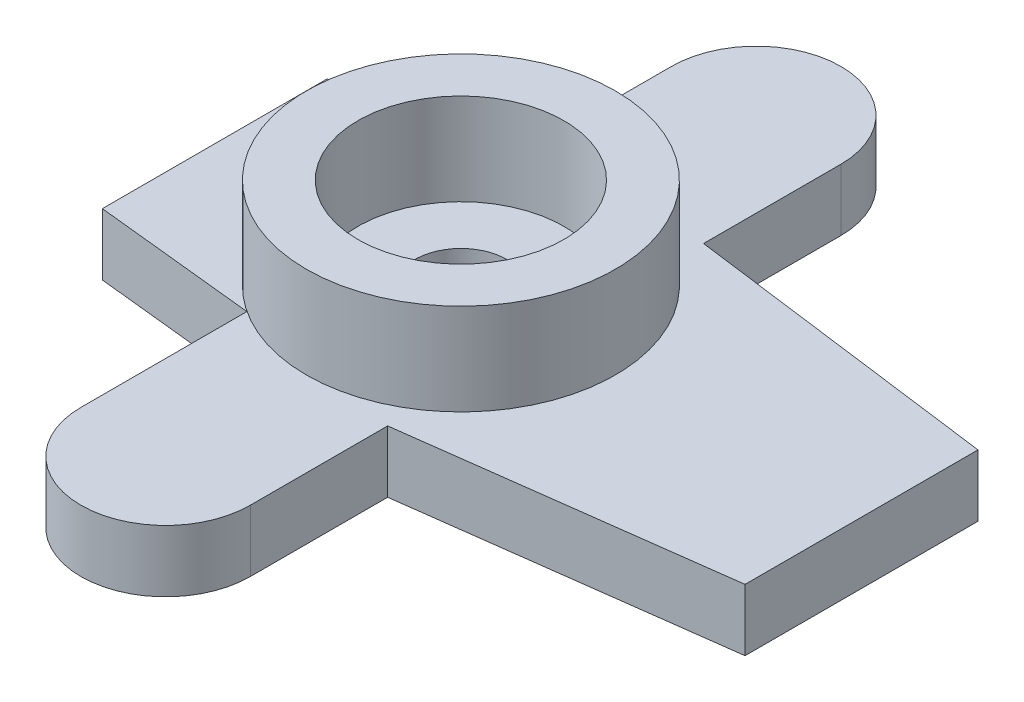
ISO-10303-21;
HEADER;
FILE_DESCRIPTION(('STEP AP214'),'2;1');
FILE_NAME('part.step','',(''),(''),'','','');
FILE_SCHEMA(('AUTOMOTIVE_DESIGN { 1 0 10303 214 1 1 1 1 }'));
ENDSEC;
DATA;
#1=APPLICATION_CONTEXT('core data for automotive mechanical design processes');
#2=APPLICATION_PROTOCOL_DEFINITION('international standard','automotive_design',2000,#1);
#3=PRODUCT_CONTEXT('',#1,'mechanical');
#4=PRODUCT('Part','Part','',(#3));
#5=PRODUCT_RELATED_PRODUCT_CATEGORY('part','',(#4));
#6=PRODUCT_DEFINITION_FORMATION('','',#4);
#7=PRODUCT_DEFINITION_CONTEXT('part definition',#1,'design');
#8=PRODUCT_DEFINITION('design','',#6,#7);
#9=PRODUCT_DEFINITION_SHAPE('','',#8);
#10=(LENGTH_UNIT() NAMED_UNIT(*) SI_UNIT(.MILLI.,.METRE.));
#11=(NAMED_UNIT(*) PLANE_ANGLE_UNIT() SI_UNIT($,.RADIAN.));
#12=(NAMED_UNIT(*) SI_UNIT($,.STERADIAN.) SOLID_ANGLE_UNIT());
#13=UNCERTAINTY_MEASURE_WITH_UNIT(LENGTH_MEASURE(1.E-05),#10,'distance_accuracy_value','');
#14=(GEOMETRIC_REPRESENTATION_CONTEXT(3) GLOBAL_UNCERTAINTY_ASSIGNED_CONTEXT((#13)) GLOBAL_UNIT_ASSIGNED_CONTEXT((#10,
#11,#12)) REPRESENTATION_CONTEXT('',''));
#15=CARTESIAN_POINT('',(0.,0.,0.));
#16=DIRECTION('',(0.,0.,1.));
#17=DIRECTION('',(1.,0.,0.));
#18=AXIS2_PLACEMENT_3D('',#15,#16,#17);
#19=CARTESIAN_POINT('',(-0.312640586171714,1.35,2.98563064108722));
#20=DIRECTION('',(-0.10414565677559,0.,0.994562055467018));
#21=DIRECTION('',(0.994562055467019,0.,0.10414565677559));
#22=AXIS2_PLACEMENT_3D('',#19,#20,#21);
#23=PLANE('',#22);
#24=DIRECTION('',(-0.994562055467019,0.,-0.10414565677559));
#25=VECTOR('',#24,1.);
#26=CARTESIAN_POINT('',(-0.312640586171714,0.,2.98563064108722));
#27=LINE('',#26,#25);
#28=CARTESIAN_POINT('',(-1.85,0.,2.82464590919123));
#29=VERTEX_POINT('',#28);
#30=CARTESIAN_POINT('',(-5.375,0.,2.45552521117549));
#31=VERTEX_POINT('',#30);
#32=EDGE_CURVE('E321',#29,#31,#27,.T.);
#33=ORIENTED_EDGE('',*,*,#32,.F.);
#34=DIRECTION('',(0.,-1.,0.));
#35=VECTOR('',#34,1.);
#36=CARTESIAN_POINT('',(-1.85,1.35,2.82464590919123));
#37=LINE('',#36,#35);
#38=CARTESIAN_POINT('',(-1.85,1.35,2.82464590919123));
#39=VERTEX_POINT('',#38);
#40=EDGE_CURVE('E12',#39,#29,#37,.T.);
#41=ORIENTED_EDGE('',*,*,#40,.F.);
#42=DIRECTION('',(-0.994562055467019,0.,-0.10414565677559));
#43=VECTOR('',#42,1.);
#44=CARTESIAN_POINT('',(-0.312640586171714,1.35,2.98563064108722));
#45=LINE('',#44,#43);
#46=CARTESIAN_POINT('',(-5.375,1.35,2.45552521117549));
#47=VERTEX_POINT('',#46);
#48=EDGE_CURVE('E340',#39,#47,#45,.T.);
#49=ORIENTED_EDGE('',*,*,#48,.T.);
#50=DIRECTION('',(0.,-1.,0.));
#51=VECTOR('',#50,1.);
#52=CARTESIAN_POINT('',(-5.375,1.35,2.45552521117549));
#53=LINE('',#52,#51);
#54=EDGE_CURVE('E193',#47,#31,#53,.T.);
#55=ORIENTED_EDGE('',*,*,#54,.T.);
#56=EDGE_LOOP('',(#33,#41,#49,#55));
#57=FACE_BOUND('',#56,.T.);
#58=ADVANCED_FACE('F173',(#57),#23,.T.);
#59=CARTESIAN_POINT('',(-0.312640586171714,1.35,-2.98563064108722));
#60=DIRECTION('',(0.10414565677559,0.,0.994562055467018));
#61=DIRECTION('',(0.994562055467019,0.,-0.10414565677559));
#62=AXIS2_PLACEMENT_3D('',#59,#60,#61);
#63=PLANE('',#62);
#64=DIRECTION('',(-0.994562055467019,0.,0.10414565677559));
#65=VECTOR('',#64,1.);
#66=CARTESIAN_POINT('',(-0.312640586171714,0.,-2.98563064108722));
#67=LINE('',#66,#65);
#68=CARTESIAN_POINT('',(-1.85,0.,-2.82464590919123));
#69=VERTEX_POINT('',#68);
#70=CARTESIAN_POINT('',(-5.375,0.,-2.45552521117549));
#71=VERTEX_POINT('',#70);
#72=EDGE_CURVE('E325',#69,#71,#67,.T.);
#73=ORIENTED_EDGE('',*,*,#72,.T.);
#74=DIRECTION('',(0.,-1.,0.));
#75=VECTOR('',#74,1.);
#76=CARTESIAN_POINT('',(-5.375,1.35,-2.45552521117549));
#77=LINE('',#76,#75);
#78=CARTESIAN_POINT('',(-5.375,1.35,-2.45552521117549));
#79=VERTEX_POINT('',#78);
#80=EDGE_CURVE('E343',#79,#71,#77,.T.);
#81=ORIENTED_EDGE('',*,*,#80,.F.);
#82=DIRECTION('',(-0.994562055467019,0.,0.10414565677559));
#83=VECTOR('',#82,1.);
#84=CARTESIAN_POINT('',(-0.312640586171714,1.35,-2.98563064108722));
#85=LINE('',#84,#83);
#86=CARTESIAN_POINT('',(-1.85,1.35,-2.82464590919123));
#87=VERTEX_POINT('',#86);
#88=EDGE_CURVE('E419',#87,#79,#85,.T.);
#89=ORIENTED_EDGE('',*,*,#88,.F.);
#90=DIRECTION('',(0.,-1.,0.));
#91=VECTOR('',#90,1.);
#92=CARTESIAN_POINT('',(-1.85,1.35,-2.82464590919123));
#93=LINE('',#92,#91);
#94=EDGE_CURVE('E184',#87,#69,#93,.T.);
#95=ORIENTED_EDGE('',*,*,#94,.T.);
#96=EDGE_LOOP('',(#73,#81,#89,#95));
#97=FACE_BOUND('',#96,.T.);
#98=ADVANCED_FACE('F421',(#97),#63,.F.);
#99=CARTESIAN_POINT('',(-5.375,1.35,0.));
#100=DIRECTION('',(-1.,0.,0.));
#101=DIRECTION('',(0.,0.,1.));
#102=AXIS2_PLACEMENT_3D('',#99,#100,#101);
#103=PLANE('',#102);
#104=DIRECTION('',(0.,0.,-1.));
#105=VECTOR('',#104,1.);
#106=CARTESIAN_POINT('',(-5.375,0.,0.));
#107=LINE('',#106,#105);
#108=EDGE_CURVE('E332',#31,#71,#107,.T.);
#109=ORIENTED_EDGE('',*,*,#108,.F.);
#110=ORIENTED_EDGE('',*,*,#54,.F.);
#111=DIRECTION('',(0.,0.,-1.));
#112=VECTOR('',#111,1.);
#113=CARTESIAN_POINT('',(-5.375,1.35,0.));
#114=LINE('',#113,#112);
#115=EDGE_CURVE('E335',#47,#79,#114,.T.);
#116=ORIENTED_EDGE('',*,*,#115,.T.);
#117=ORIENTED_EDGE('',*,*,#80,.T.);
#118=EDGE_LOOP('',(#109,#110,#116,#117));
#119=FACE_BOUND('',#118,.T.);
#120=ADVANCED_FACE('F483',(#119),#103,.T.);
#121=CARTESIAN_POINT('',(0.,1.35,0.));
#122=DIRECTION('',(0.,1.,0.));
#123=DIRECTION('',(0.,0.,1.));
#124=AXIS2_PLACEMENT_3D('',#121,#122,#123);
#125=PLANE('',#124);
#126=CARTESIAN_POINT('',(0.,1.35,0.));
#127=DIRECTION('',(0.,1.,0.));
#128=DIRECTION('',(0.,0.,1.));
#129=AXIS2_PLACEMENT_3D('',#126,#127,#128);
#130=CIRCLE('',#129,3.375);
#131=CARTESIAN_POINT('',(0.,1.35,3.375));
#132=VERTEX_POINT('',#131);
#133=EDGE_CURVE('E427',#132,#132,#130,.T.);
#134=ORIENTED_EDGE('',*,*,#133,.F.);
#135=EDGE_LOOP('',(#134));
#136=FACE_BOUND('',#135,.T.);
#137=DIRECTION('',(0.,0.,-1.));
#138=VECTOR('',#137,1.);
#139=CARTESIAN_POINT('',(-1.85,1.35,0.));
#140=LINE('',#139,#138);
#141=CARTESIAN_POINT('',(-1.85,1.35,-6.45));
#142=VERTEX_POINT('',#141);
#143=EDGE_CURVE('E350',#87,#142,#140,.T.);
#144=ORIENTED_EDGE('',*,*,#143,.F.);
#145=ORIENTED_EDGE('',*,*,#88,.T.);
#146=ORIENTED_EDGE('',*,*,#115,.F.);
#147=ORIENTED_EDGE('',*,*,#48,.F.);
#148=DIRECTION('',(0.,0.,-1.));
#149=VECTOR('',#148,1.);
#150=CARTESIAN_POINT('',(-1.85,1.35,0.));
#151=LINE('',#150,#149);
#152=CARTESIAN_POINT('',(-1.85,1.35,6.45));
#153=VERTEX_POINT('',#152);
#154=EDGE_CURVE('E353',#153,#39,#151,.T.);
#155=ORIENTED_EDGE('',*,*,#154,.F.);
#156=CARTESIAN_POINT('',(0.,1.35,6.45));
#157=DIRECTION('',(0.,1.,0.));
#158=DIRECTION('',(0.,0.,1.));
#159=AXIS2_PLACEMENT_3D('',#156,#157,#158);
#160=CIRCLE('',#159,1.85);
#161=CARTESIAN_POINT('',(1.85,1.35,6.45));
#162=VERTEX_POINT('',#161);
#163=EDGE_CURVE('E357',#153,#162,#160,.T.);
#164=ORIENTED_EDGE('',*,*,#163,.T.);
#165=DIRECTION('',(0.,0.,-1.));
#166=VECTOR('',#165,1.);
#167=CARTESIAN_POINT('',(1.85,1.35,0.));
#168=LINE('',#167,#166);
#169=CARTESIAN_POINT('',(1.85,1.35,3.45));
#170=VERTEX_POINT('',#169);
#171=EDGE_CURVE('E360',#162,#170,#168,.T.);
#172=ORIENTED_EDGE('',*,*,#171,.T.);
#173=DIRECTION('',(0.991488349625111,0.,-0.130195439849762));
#174=VECTOR('',#173,1.);
#175=CARTESIAN_POINT('',(0.476710130391174,1.35,3.63033099297894));
#176=LINE('',#175,#174);
#177=CARTESIAN_POINT('',(8.75,1.35,2.54393939393939));
#178=VERTEX_POINT('',#177);
#179=EDGE_CURVE('E364',#170,#178,#176,.T.);
#180=ORIENTED_EDGE('',*,*,#179,.T.);
#181=DIRECTION('',(0.,0.,-1.));
#182=VECTOR('',#181,1.);
#183=CARTESIAN_POINT('',(8.75,1.35,0.));
#184=LINE('',#183,#182);
#185=CARTESIAN_POINT('',(8.75,1.35,-2.54393939393939));
#186=VERTEX_POINT('',#185);
#187=EDGE_CURVE('E367',#178,#186,#184,.T.);
#188=ORIENTED_EDGE('',*,*,#187,.T.);
#189=DIRECTION('',(0.991488349625111,0.,0.130195439849762));
#190=VECTOR('',#189,1.);
#191=CARTESIAN_POINT('',(0.476710130391174,1.35,-3.63033099297894));
#192=LINE('',#191,#190);
#193=CARTESIAN_POINT('',(1.85,1.35,-3.45));
#194=VERTEX_POINT('',#193);
#195=EDGE_CURVE('E272',#194,#186,#192,.T.);
#196=ORIENTED_EDGE('',*,*,#195,.F.);
#197=DIRECTION('',(0.,0.,-1.));
#198=VECTOR('',#197,1.);
#199=CARTESIAN_POINT('',(1.85,1.35,0.));
#200=LINE('',#199,#198);
#201=CARTESIAN_POINT('',(1.85,1.35,-6.45));
#202=VERTEX_POINT('',#201);
#203=EDGE_CURVE('E269',#194,#202,#200,.T.);
#204=ORIENTED_EDGE('',*,*,#203,.T.);
#205=CARTESIAN_POINT('',(0.,1.35,-6.45));
#206=DIRECTION('',(0.,1.,0.));
#207=DIRECTION('',(0.,0.,1.));
#208=AXIS2_PLACEMENT_3D('',#205,#206,#207);
#209=CIRCLE('',#208,1.85);
#210=EDGE_CURVE('E293',#202,#142,#209,.T.);
#211=ORIENTED_EDGE('',*,*,#210,.T.);
#212=EDGE_LOOP('',(#144,#145,#146,#147,#155,#164,#172,#180,#188,#196,#204,#211));
#213=FACE_BOUND('',#212,.T.);
#214=ADVANCED_FACE('F398',(#136,#213),#125,.T.);
#215=CARTESIAN_POINT('',(0.,0.,0.));
#216=DIRECTION('',(0.,1.,0.));
#217=DIRECTION('',(0.,0.,1.));
#218=AXIS2_PLACEMENT_3D('',#215,#216,#217);
#219=PLANE('',#218);
#220=CARTESIAN_POINT('',(0.,0.,0.));
#221=DIRECTION('',(0.,1.,0.));
#222=DIRECTION('',(0.,0.,1.));
#223=AXIS2_PLACEMENT_3D('',#220,#221,#222);
#224=CIRCLE('',#223,1.);
#225=CARTESIAN_POINT('',(0.,0.,1.));
#226=VERTEX_POINT('',#225);
#227=EDGE_CURVE('E439',#226,#226,#224,.T.);
#228=ORIENTED_EDGE('',*,*,#227,.T.);
#229=EDGE_LOOP('',(#228));
#230=FACE_BOUND('',#229,.T.);
#231=ORIENTED_EDGE('',*,*,#72,.F.);
#232=DIRECTION('',(0.,0.,-1.));
#233=VECTOR('',#232,1.);
#234=CARTESIAN_POINT('',(-1.85,0.,0.));
#235=LINE('',#234,#233);
#236=CARTESIAN_POINT('',(-1.85,0.,-6.45));
#237=VERTEX_POINT('',#236);
#238=EDGE_CURVE('E374',#69,#237,#235,.T.);
#239=ORIENTED_EDGE('',*,*,#238,.T.);
#240=CARTESIAN_POINT('',(0.,0.,-6.45));
#241=DIRECTION('',(0.,1.,0.));
#242=DIRECTION('',(0.,0.,1.));
#243=AXIS2_PLACEMENT_3D('',#240,#241,#242);
#244=CIRCLE('',#243,1.85);
#245=CARTESIAN_POINT('',(1.85,0.,-6.45));
#246=VERTEX_POINT('',#245);
#247=EDGE_CURVE('E282',#246,#237,#244,.T.);
#248=ORIENTED_EDGE('',*,*,#247,.F.);
#249=DIRECTION('',(0.,0.,-1.));
#250=VECTOR('',#249,1.);
#251=CARTESIAN_POINT('',(1.85,0.,0.));
#252=LINE('',#251,#250);
#253=CARTESIAN_POINT('',(1.85,0.,-3.45));
#254=VERTEX_POINT('',#253);
#255=EDGE_CURVE('E267',#254,#246,#252,.T.);
#256=ORIENTED_EDGE('',*,*,#255,.F.);
#257=DIRECTION('',(0.991488349625111,0.,0.130195439849762));
#258=VECTOR('',#257,1.);
#259=CARTESIAN_POINT('',(0.476710130391174,0.,-3.63033099297894));
#260=LINE('',#259,#258);
#261=CARTESIAN_POINT('',(8.75,0.,-2.54393939393939));
#262=VERTEX_POINT('',#261);
#263=EDGE_CURVE('E279',#254,#262,#260,.T.);
#264=ORIENTED_EDGE('',*,*,#263,.T.);
#265=DIRECTION('',(0.,0.,-1.));
#266=VECTOR('',#265,1.);
#267=CARTESIAN_POINT('',(8.75,0.,0.));
#268=LINE('',#267,#266);
#269=CARTESIAN_POINT('',(8.75,0.,2.54393939393939));
#270=VERTEX_POINT('',#269);
#271=EDGE_CURVE('E289',#270,#262,#268,.T.);
#272=ORIENTED_EDGE('',*,*,#271,.F.);
#273=DIRECTION('',(0.991488349625111,0.,-0.130195439849762));
#274=VECTOR('',#273,1.);
#275=CARTESIAN_POINT('',(0.476710130391174,0.,3.63033099297894));
#276=LINE('',#275,#274);
#277=CARTESIAN_POINT('',(1.85,0.,3.45));
#278=VERTEX_POINT('',#277);
#279=EDGE_CURVE('E295',#278,#270,#276,.T.);
#280=ORIENTED_EDGE('',*,*,#279,.F.);
#281=DIRECTION('',(0.,0.,-1.));
#282=VECTOR('',#281,1.);
#283=CARTESIAN_POINT('',(1.85,0.,0.));
#284=LINE('',#283,#282);
#285=CARTESIAN_POINT('',(1.85,0.,6.45));
#286=VERTEX_POINT('',#285);
#287=EDGE_CURVE('E383',#286,#278,#284,.T.);
#288=ORIENTED_EDGE('',*,*,#287,.F.);
#289=CARTESIAN_POINT('',(0.,0.,6.45));
#290=DIRECTION('',(0.,1.,0.));
#291=DIRECTION('',(0.,0.,1.));
#292=AXIS2_PLACEMENT_3D('',#289,#290,#291);
#293=CIRCLE('',#292,1.85);
#294=CARTESIAN_POINT('',(-1.85,0.,6.45));
#295=VERTEX_POINT('',#294);
#296=EDGE_CURVE('E380',#295,#286,#293,.T.);
#297=ORIENTED_EDGE('',*,*,#296,.F.);
#298=DIRECTION('',(0.,0.,-1.));
#299=VECTOR('',#298,1.);
#300=CARTESIAN_POINT('',(-1.85,0.,0.));
#301=LINE('',#300,#299);
#302=EDGE_CURVE('E377',#295,#29,#301,.T.);
#303=ORIENTED_EDGE('',*,*,#302,.T.);
#304=ORIENTED_EDGE('',*,*,#32,.T.);
#305=ORIENTED_EDGE('',*,*,#108,.T.);
#306=EDGE_LOOP('',(#231,#239,#248,#256,#264,#272,#280,#288,#297,#303,#304,#305));
#307=FACE_BOUND('',#306,.T.);
#308=ADVANCED_FACE('F277',(#230,#307),#219,.F.);
#309=CARTESIAN_POINT('',(0.476710130391174,1.35,3.63033099297894));
#310=DIRECTION('',(-0.130195439849762,0.,-0.991488349625111));
#311=DIRECTION('',(-0.991488349625111,0.,0.130195439849762));
#312=AXIS2_PLACEMENT_3D('',#309,#310,#311);
#313=PLANE('',#312);
#314=ORIENTED_EDGE('',*,*,#279,.T.);
#315=DIRECTION('',(0.,-1.,0.));
#316=VECTOR('',#315,1.);
#317=CARTESIAN_POINT('',(8.75,1.35,2.54393939393939));
#318=LINE('',#317,#316);
#319=EDGE_CURVE('E301',#178,#270,#318,.T.);
#320=ORIENTED_EDGE('',*,*,#319,.F.);
#321=ORIENTED_EDGE('',*,*,#179,.F.);
#322=DIRECTION('',(0.,-1.,0.));
#323=VECTOR('',#322,1.);
#324=CARTESIAN_POINT('',(1.85,1.35,3.45));
#325=LINE('',#324,#323);
#326=EDGE_CURVE('E305',#170,#278,#325,.T.);
#327=ORIENTED_EDGE('',*,*,#326,.T.);
#328=EDGE_LOOP('',(#314,#320,#321,#327));
#329=FACE_BOUND('',#328,.T.);
#330=ADVANCED_FACE('F390',(#329),#313,.F.);
#331=CARTESIAN_POINT('',(8.75,1.35,0.));
#332=DIRECTION('',(-1.,0.,0.));
#333=DIRECTION('',(0.,0.,1.));
#334=AXIS2_PLACEMENT_3D('',#331,#332,#333);
#335=PLANE('',#334);
#336=ORIENTED_EDGE('',*,*,#271,.T.);
#337=DIRECTION('',(0.,-1.,0.));
#338=VECTOR('',#337,1.);
#339=CARTESIAN_POINT('',(8.75,1.35,-2.54393939393939));
#340=LINE('',#339,#338);
#341=EDGE_CURVE('E258',#186,#262,#340,.T.);
#342=ORIENTED_EDGE('',*,*,#341,.F.);
#343=ORIENTED_EDGE('',*,*,#187,.F.);
#344=ORIENTED_EDGE('',*,*,#319,.T.);
#345=EDGE_LOOP('',(#336,#342,#343,#344));
#346=FACE_BOUND('',#345,.T.);
#347=ADVANCED_FACE('F395',(#346),#335,.F.);
#348=CARTESIAN_POINT('',(0.476710130391174,1.35,-3.63033099297894));
#349=DIRECTION('',(0.130195439849762,0.,-0.991488349625111));
#350=DIRECTION('',(-0.991488349625111,0.,-0.130195439849762));
#351=AXIS2_PLACEMENT_3D('',#348,#349,#350);
#352=PLANE('',#351);
#353=ORIENTED_EDGE('',*,*,#263,.F.);
#354=DIRECTION('',(0.,-1.,0.));
#355=VECTOR('',#354,1.);
#356=CARTESIAN_POINT('',(1.85,1.35,-3.45));
#357=LINE('',#356,#355);
#358=EDGE_CURVE('E264',#194,#254,#357,.T.);
#359=ORIENTED_EDGE('',*,*,#358,.F.);
#360=ORIENTED_EDGE('',*,*,#195,.T.);
#361=ORIENTED_EDGE('',*,*,#341,.T.);
#362=EDGE_LOOP('',(#353,#359,#360,#361));
#363=FACE_BOUND('',#362,.T.);
#364=ADVANCED_FACE('F287',(#363),#352,.T.);
#365=CARTESIAN_POINT('',(1.85,1.35,0.));
#366=DIRECTION('',(-1.,0.,0.));
#367=DIRECTION('',(0.,0.,1.));
#368=AXIS2_PLACEMENT_3D('',#365,#366,#367);
#369=PLANE('',#368);
#370=ORIENTED_EDGE('',*,*,#255,.T.);
#371=DIRECTION('',(0.,-1.,0.));
#372=VECTOR('',#371,1.);
#373=CARTESIAN_POINT('',(1.85,1.35,-6.45));
#374=LINE('',#373,#372);
#375=EDGE_CURVE('E177',#202,#246,#374,.T.);
#376=ORIENTED_EDGE('',*,*,#375,.F.);
#377=ORIENTED_EDGE('',*,*,#203,.F.);
#378=ORIENTED_EDGE('',*,*,#358,.T.);
#379=EDGE_LOOP('',(#370,#376,#377,#378));
#380=FACE_BOUND('',#379,.T.);
#381=ADVANCED_FACE('F175',(#380),#369,.F.);
#382=CARTESIAN_POINT('',(1.85,1.35,0.));
#383=DIRECTION('',(-1.,0.,0.));
#384=DIRECTION('',(0.,0.,1.));
#385=AXIS2_PLACEMENT_3D('',#382,#383,#384);
#386=PLANE('',#385);
#387=ORIENTED_EDGE('',*,*,#287,.T.);
#388=ORIENTED_EDGE('',*,*,#326,.F.);
#389=ORIENTED_EDGE('',*,*,#171,.F.);
#390=DIRECTION('',(0.,-1.,0.));
#391=VECTOR('',#390,1.);
#392=CARTESIAN_POINT('',(1.85,1.35,6.45));
#393=LINE('',#392,#391);
#394=EDGE_CURVE('E308',#162,#286,#393,.T.);
#395=ORIENTED_EDGE('',*,*,#394,.T.);
#396=EDGE_LOOP('',(#387,#388,#389,#395));
#397=FACE_BOUND('',#396,.T.);
#398=ADVANCED_FACE('F404',(#397),#386,.F.);
#399=CARTESIAN_POINT('',(0.,1.35,6.45));
#400=DIRECTION('',(0.,-1.,0.));
#401=DIRECTION('',(0.,0.,-1.));
#402=AXIS2_PLACEMENT_3D('',#399,#400,#401);
#403=CYLINDRICAL_SURFACE('',#402,1.85);
#404=ORIENTED_EDGE('',*,*,#296,.T.);
#405=ORIENTED_EDGE('',*,*,#394,.F.);
#406=ORIENTED_EDGE('',*,*,#163,.F.);
#407=DIRECTION('',(0.,-1.,0.));
#408=VECTOR('',#407,1.);
#409=CARTESIAN_POINT('',(-1.85,1.35,6.45));
#410=LINE('',#409,#408);
#411=EDGE_CURVE('E312',#153,#295,#410,.T.);
#412=ORIENTED_EDGE('',*,*,#411,.T.);
#413=EDGE_LOOP('',(#404,#405,#406,#412));
#414=FACE_BOUND('',#413,.T.);
#415=ADVANCED_FACE('F499',(#414),#403,.T.);
#416=CARTESIAN_POINT('',(0.,1.35,-6.45));
#417=DIRECTION('',(0.,-1.,0.));
#418=DIRECTION('',(0.,0.,-1.));
#419=AXIS2_PLACEMENT_3D('',#416,#417,#418);
#420=CYLINDRICAL_SURFACE('',#419,1.85);
#421=ORIENTED_EDGE('',*,*,#247,.T.);
#422=DIRECTION('',(0.,-1.,0.));
#423=VECTOR('',#422,1.);
#424=CARTESIAN_POINT('',(-1.85,1.35,-6.45));
#425=LINE('',#424,#423);
#426=EDGE_CURVE('E314',#142,#237,#425,.T.);
#427=ORIENTED_EDGE('',*,*,#426,.F.);
#428=ORIENTED_EDGE('',*,*,#210,.F.);
#429=ORIENTED_EDGE('',*,*,#375,.T.);
#430=EDGE_LOOP('',(#421,#427,#428,#429));
#431=FACE_BOUND('',#430,.T.);
#432=ADVANCED_FACE('F492',(#431),#420,.T.);
#433=CARTESIAN_POINT('',(-1.85,1.35,0.));
#434=DIRECTION('',(-1.,0.,0.));
#435=DIRECTION('',(0.,0.,1.));
#436=AXIS2_PLACEMENT_3D('',#433,#434,#435);
#437=PLANE('',#436);
#438=ORIENTED_EDGE('',*,*,#238,.F.);
#439=ORIENTED_EDGE('',*,*,#94,.F.);
#440=ORIENTED_EDGE('',*,*,#143,.T.);
#441=ORIENTED_EDGE('',*,*,#426,.T.);
#442=EDGE_LOOP('',(#438,#439,#440,#441));
#443=FACE_BOUND('',#442,.T.);
#444=ADVANCED_FACE('F416',(#443),#437,.T.);
#445=CARTESIAN_POINT('',(-1.85,1.35,0.));
#446=DIRECTION('',(-1.,0.,0.));
#447=DIRECTION('',(0.,0.,1.));
#448=AXIS2_PLACEMENT_3D('',#445,#446,#447);
#449=PLANE('',#448);
#450=ORIENTED_EDGE('',*,*,#302,.F.);
#451=ORIENTED_EDGE('',*,*,#411,.F.);
#452=ORIENTED_EDGE('',*,*,#154,.T.);
#453=ORIENTED_EDGE('',*,*,#40,.T.);
#454=EDGE_LOOP('',(#450,#451,#452,#453));
#455=FACE_BOUND('',#454,.T.);
#456=ADVANCED_FACE('F409',(#455),#449,.T.);
#457=CARTESIAN_POINT('',(0.,3.35,0.));
#458=DIRECTION('',(0.,-1.,0.));
#459=DIRECTION('',(0.,0.,-1.));
#460=AXIS2_PLACEMENT_3D('',#457,#458,#459);
#461=CYLINDRICAL_SURFACE('',#460,3.375);
#462=CARTESIAN_POINT('',(0.,3.35,0.));
#463=DIRECTION('',(0.,1.,0.));
#464=DIRECTION('',(0.,0.,1.));
#465=AXIS2_PLACEMENT_3D('',#462,#463,#464);
#466=CIRCLE('',#465,3.375);
#467=CARTESIAN_POINT('',(0.,3.35,3.375));
#468=VERTEX_POINT('',#467);
#469=EDGE_CURVE('E285',#468,#468,#466,.T.);
#470=ORIENTED_EDGE('',*,*,#469,.F.);
#471=EDGE_LOOP('',(#470));
#472=FACE_BOUND('',#471,.T.);
#473=ORIENTED_EDGE('',*,*,#133,.T.);
#474=EDGE_LOOP('',(#473));
#475=FACE_BOUND('',#474,.T.);
#476=ADVANCED_FACE('F473',(#472,#475),#461,.T.);
#477=CARTESIAN_POINT('',(0.,3.35,0.));
#478=DIRECTION('',(0.,1.,0.));
#479=DIRECTION('',(0.,0.,1.));
#480=AXIS2_PLACEMENT_3D('',#477,#478,#479);
#481=PLANE('',#480);
#482=CARTESIAN_POINT('',(0.,3.35,0.));
#483=DIRECTION('',(0.,1.,0.));
#484=DIRECTION('',(0.,0.,1.));
#485=AXIS2_PLACEMENT_3D('',#482,#483,#484);
#486=CIRCLE('',#485,2.25);
#487=CARTESIAN_POINT('',(0.,3.35,2.25));
#488=VERTEX_POINT('',#487);
#489=EDGE_CURVE('E435',#488,#488,#486,.T.);
#490=ORIENTED_EDGE('',*,*,#489,.F.);
#491=EDGE_LOOP('',(#490));
#492=FACE_BOUND('',#491,.T.);
#493=ORIENTED_EDGE('',*,*,#469,.T.);
#494=EDGE_LOOP('',(#493));
#495=FACE_BOUND('',#494,.T.);
#496=ADVANCED_FACE('F467',(#492,#495),#481,.T.);
#497=CARTESIAN_POINT('',(0.,1.35,0.));
#498=DIRECTION('',(0.,1.,0.));
#499=DIRECTION('',(0.,0.,1.));
#500=AXIS2_PLACEMENT_3D('',#497,#498,#499);
#501=CYLINDRICAL_SURFACE('',#500,2.25);
#502=CARTESIAN_POINT('',(0.,1.35,0.));
#503=DIRECTION('',(0.,1.,0.));
#504=DIRECTION('',(0.,0.,1.));
#505=AXIS2_PLACEMENT_3D('',#502,#503,#504);
#506=CIRCLE('',#505,2.25);
#507=CARTESIAN_POINT('',(0.,1.35,2.25));
#508=VERTEX_POINT('',#507);
#509=EDGE_CURVE('E431',#508,#508,#506,.T.);
#510=ORIENTED_EDGE('',*,*,#509,.F.);
#511=EDGE_LOOP('',(#510));
#512=FACE_BOUND('',#511,.T.);
#513=ORIENTED_EDGE('',*,*,#489,.T.);
#514=EDGE_LOOP('',(#513));
#515=FACE_BOUND('',#514,.T.);
#516=ADVANCED_FACE('F461',(#512,#515),#501,.F.);
#517=CARTESIAN_POINT('',(0.,1.35,0.));
#518=DIRECTION('',(0.,1.,0.));
#519=DIRECTION('',(0.,0.,1.));
#520=AXIS2_PLACEMENT_3D('',#517,#518,#519);
#521=PLANE('',#520);
#522=CARTESIAN_POINT('',(0.,1.35,0.));
#523=DIRECTION('',(0.,1.,0.));
#524=DIRECTION('',(0.,0.,1.));
#525=AXIS2_PLACEMENT_3D('',#522,#523,#524);
#526=CIRCLE('',#525,1.);
#527=CARTESIAN_POINT('',(0.,1.35,1.));
#528=VERTEX_POINT('',#527);
#529=EDGE_CURVE('E443',#528,#528,#526,.T.);
#530=ORIENTED_EDGE('',*,*,#529,.F.);
#531=EDGE_LOOP('',(#530));
#532=FACE_BOUND('',#531,.T.);
#533=ORIENTED_EDGE('',*,*,#509,.T.);
#534=EDGE_LOOP('',(#533));
#535=FACE_BOUND('',#534,.T.);
#536=ADVANCED_FACE('F455',(#532,#535),#521,.T.);
#537=CARTESIAN_POINT('',(0.,0.,0.));
#538=DIRECTION('',(0.,1.,0.));
#539=DIRECTION('',(0.,0.,1.));
#540=AXIS2_PLACEMENT_3D('',#537,#538,#539);
#541=CYLINDRICAL_SURFACE('',#540,1.);
#542=CARTESIAN_POINT('',(0.,0.,1.));
#543=CARTESIAN_POINT('',(0.,0.0140625,1.));
#544=CARTESIAN_POINT('',(0.,0.028125,1.));
#545=CARTESIAN_POINT('',(0.,0.05625,1.));
#546=CARTESIAN_POINT('',(0.,0.0703125,1.));
#547=CARTESIAN_POINT('',(0.,0.0984375,1.));
#548=CARTESIAN_POINT('',(0.,0.1125,1.));
#549=CARTESIAN_POINT('',(0.,0.140625,1.));
#550=CARTESIAN_POINT('',(0.,0.1546875,1.));
#551=CARTESIAN_POINT('',(0.,0.1828125,1.));
#552=CARTESIAN_POINT('',(0.,0.196875,1.));
#553=CARTESIAN_POINT('',(0.,0.225,1.));
#554=CARTESIAN_POINT('',(0.,0.2390625,1.));
#555=CARTESIAN_POINT('',(0.,0.2671875,1.));
#556=CARTESIAN_POINT('',(0.,0.28125,1.));
#557=CARTESIAN_POINT('',(0.,0.309375,1.));
#558=CARTESIAN_POINT('',(0.,0.3234375,1.));
#559=CARTESIAN_POINT('',(0.,0.3515625,1.));
#560=CARTESIAN_POINT('',(0.,0.365625,1.));
#561=CARTESIAN_POINT('',(0.,0.39375,1.));
#562=CARTESIAN_POINT('',(0.,0.4078125,1.));
#563=CARTESIAN_POINT('',(0.,0.4359375,1.));
#564=CARTESIAN_POINT('',(0.,0.45,1.));
#565=CARTESIAN_POINT('',(0.,0.478125,1.));
#566=CARTESIAN_POINT('',(0.,0.4921875,1.));
#567=CARTESIAN_POINT('',(0.,0.5203125,1.));
#568=CARTESIAN_POINT('',(0.,0.534375,1.));
#569=CARTESIAN_POINT('',(0.,0.5625,1.));
#570=CARTESIAN_POINT('',(0.,0.5765625,1.));
#571=CARTESIAN_POINT('',(0.,0.6046875,1.));
#572=CARTESIAN_POINT('',(0.,0.61875,1.));
#573=CARTESIAN_POINT('',(0.,0.646875,1.));
#574=CARTESIAN_POINT('',(0.,0.6609375,1.));
#575=CARTESIAN_POINT('',(0.,0.6890625,1.));
#576=CARTESIAN_POINT('',(0.,0.703125,1.));
#577=CARTESIAN_POINT('',(0.,0.73125,1.));
#578=CARTESIAN_POINT('',(0.,0.7453125,1.));
#579=CARTESIAN_POINT('',(0.,0.7734375,1.));
#580=CARTESIAN_POINT('',(0.,0.7875,1.));
#581=CARTESIAN_POINT('',(0.,0.815625,1.));
#582=CARTESIAN_POINT('',(0.,0.8296875,1.));
#583=CARTESIAN_POINT('',(0.,0.8578125,1.));
#584=CARTESIAN_POINT('',(0.,0.871875,1.));
#585=CARTESIAN_POINT('',(0.,0.9,1.));
#586=CARTESIAN_POINT('',(0.,0.9140625,1.));
#587=CARTESIAN_POINT('',(0.,0.9421875,1.));
#588=CARTESIAN_POINT('',(0.,0.95625,1.));
#589=CARTESIAN_POINT('',(0.,0.984375,1.));
#590=CARTESIAN_POINT('',(0.,0.9984375,1.));
#591=CARTESIAN_POINT('',(0.,1.0265625,1.));
#592=CARTESIAN_POINT('',(0.,1.040625,1.));
#593=CARTESIAN_POINT('',(0.,1.06875,1.));
#594=CARTESIAN_POINT('',(0.,1.0828125,1.));
#595=CARTESIAN_POINT('',(0.,1.1109375,1.));
#596=CARTESIAN_POINT('',(0.,1.125,1.));
#597=CARTESIAN_POINT('',(0.,1.153125,1.));
#598=CARTESIAN_POINT('',(0.,1.1671875,1.));
#599=CARTESIAN_POINT('',(0.,1.1953125,1.));
#600=CARTESIAN_POINT('',(0.,1.209375,1.));
#601=CARTESIAN_POINT('',(0.,1.2375,1.));
#602=CARTESIAN_POINT('',(0.,1.2515625,1.));
#603=CARTESIAN_POINT('',(0.,1.2796875,1.));
#604=CARTESIAN_POINT('',(0.,1.29375,1.));
#605=CARTESIAN_POINT('',(0.,1.321875,1.));
#606=CARTESIAN_POINT('',(0.,1.3359375,1.));
#607=CARTESIAN_POINT('',(0.,1.35,1.));
#608=B_SPLINE_CURVE_WITH_KNOTS('',3,(#542,#543,#544,#545,#546,#547,#548,#549,#550,#551,#552,
#553,#554,#555,#556,#557,#558,#559,#560,#561,#562,#563,#564,#565,#566,#567,#568,#569,#570,#571,
#572,#573,#574,#575,#576,#577,#578,#579,#580,#581,#582,#583,#584,#585,#586,#587,#588,#589,#590,
#591,#592,#593,#594,#595,#596,#597,#598,#599,#600,#601,#602,#603,#604,#605,#606,#607),
.UNSPECIFIED.,.F.,.F.,(4,2,2,2,2,2,2,2,2,2,2,2,2,2,2,2,2,2,2,2,2,2,2,2,2,2,2,2,2,2,2,2,4),(0.,
0.0421875,0.084375,0.1265625,0.16875,0.2109375,0.253125,0.2953125,0.3375,0.3796875,0.421875,
0.4640625,0.50625,0.5484375,0.590625,0.6328125,0.675,0.7171875,0.759375,0.8015625,0.84375,
0.8859375,0.928125,0.9703125,1.0125,1.0546875,1.096875,1.1390625,1.18125,1.2234375,1.265625,
1.3078125,1.35),.UNSPECIFIED.);
#609=EDGE_CURVE('BSEAM452',#226,#528,#608,.T.);
#610=ORIENTED_EDGE('',*,*,#227,.F.);
#611=ORIENTED_EDGE('',*,*,#529,.T.);
#612=ORIENTED_EDGE('',*,*,#609,.T.);
#613=ORIENTED_EDGE('',*,*,#609,.F.);
#614=EDGE_LOOP('',(#610,#612,#611,#613));
#615=FACE_BOUND('',#614,.T.);
#616=ADVANCED_FACE('F452',(#615),#541,.F.);
#617=CLOSED_SHELL('',(#58,#98,#120,#214,#308,#330,#347,#364,#381,#398,#415,#432,#444,#456,#476,
#496,#516,#536,#616));
#618=MANIFOLD_SOLID_BREP('B2',#617);
#619=ADVANCED_BREP_SHAPE_REPRESENTATION('',(#18,#618),#14);
#620=SHAPE_DEFINITION_REPRESENTATION(#9,#619);
ENDSEC;
END-ISO-10303-21;
